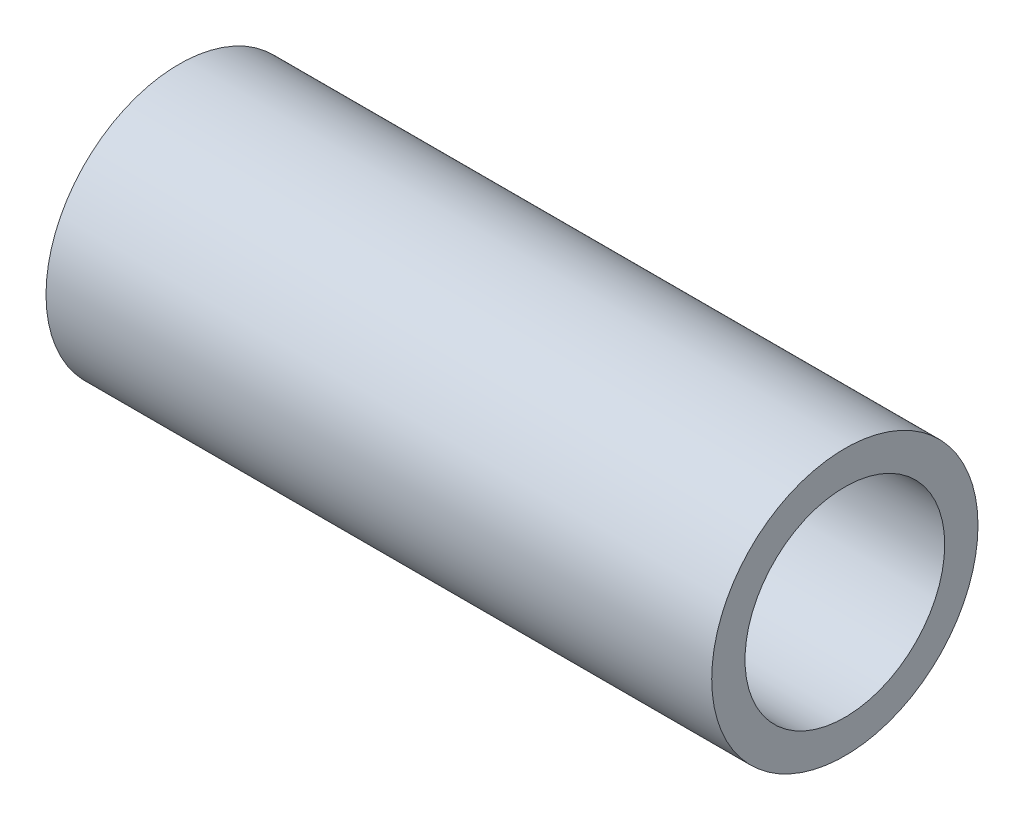
ISO-10303-21;
HEADER;
FILE_DESCRIPTION(('STEP AP214'),'2;1');
FILE_NAME('part.step','',(''),(''),'','','');
FILE_SCHEMA(('AUTOMOTIVE_DESIGN { 1 0 10303 214 1 1 1 1 }'));
ENDSEC;
DATA;
#1=APPLICATION_CONTEXT('core data for automotive mechanical design processes');
#2=APPLICATION_PROTOCOL_DEFINITION('international standard','automotive_design',2000,#1);
#3=PRODUCT_CONTEXT('',#1,'mechanical');
#4=PRODUCT('Part','Part','',(#3));
#5=PRODUCT_RELATED_PRODUCT_CATEGORY('part','',(#4));
#6=PRODUCT_DEFINITION_FORMATION('','',#4);
#7=PRODUCT_DEFINITION_CONTEXT('part definition',#1,'design');
#8=PRODUCT_DEFINITION('design','',#6,#7);
#9=PRODUCT_DEFINITION_SHAPE('','',#8);
#10=(LENGTH_UNIT() NAMED_UNIT(*) SI_UNIT(.MILLI.,.METRE.));
#11=(NAMED_UNIT(*) PLANE_ANGLE_UNIT() SI_UNIT($,.RADIAN.));
#12=(NAMED_UNIT(*) SI_UNIT($,.STERADIAN.) SOLID_ANGLE_UNIT());
#13=UNCERTAINTY_MEASURE_WITH_UNIT(LENGTH_MEASURE(1.E-05),#10,'distance_accuracy_value','');
#14=(GEOMETRIC_REPRESENTATION_CONTEXT(3) GLOBAL_UNCERTAINTY_ASSIGNED_CONTEXT((#13)) GLOBAL_UNIT_ASSIGNED_CONTEXT((#10,
#11,#12)) REPRESENTATION_CONTEXT('',''));
#15=CARTESIAN_POINT('',(0.,0.,0.));
#16=DIRECTION('',(0.,0.,1.));
#17=DIRECTION('',(1.,0.,0.));
#18=AXIS2_PLACEMENT_3D('',#15,#16,#17);
#19=CARTESIAN_POINT('',(15.875,0.,0.));
#20=DIRECTION('',(1.,0.,0.));
#21=DIRECTION('',(0.,0.,-1.));
#22=AXIS2_PLACEMENT_3D('',#19,#20,#21);
#23=PLANE('',#22);
#24=CARTESIAN_POINT('',(15.875,0.,0.));
#25=DIRECTION('',(1.,0.,0.));
#26=DIRECTION('',(0.,0.,-1.));
#27=AXIS2_PLACEMENT_3D('',#24,#25,#26);
#28=CIRCLE('',#27,6.35);
#29=CARTESIAN_POINT('',(15.875,0.,-6.35));
#30=VERTEX_POINT('',#29);
#31=EDGE_CURVE('E10',#30,#30,#28,.T.);
#32=ORIENTED_EDGE('',*,*,#31,.T.);
#33=EDGE_LOOP('',(#32));
#34=FACE_BOUND('',#33,.T.);
#35=CARTESIAN_POINT('',(15.875,0.,0.));
#36=DIRECTION('',(1.,0.,0.));
#37=DIRECTION('',(0.,0.,-1.));
#38=AXIS2_PLACEMENT_3D('',#35,#36,#37);
#39=CIRCLE('',#38,4.7625);
#40=CARTESIAN_POINT('',(15.875,0.,-4.7625));
#41=VERTEX_POINT('',#40);
#42=EDGE_CURVE('E44',#41,#41,#39,.T.);
#43=ORIENTED_EDGE('',*,*,#42,.F.);
#44=EDGE_LOOP('',(#43));
#45=FACE_BOUND('',#44,.T.);
#46=ADVANCED_FACE('F33',(#34,#45),#23,.T.);
#47=CARTESIAN_POINT('',(-15.875,0.,0.));
#48=DIRECTION('',(1.,0.,0.));
#49=DIRECTION('',(0.,0.,-1.));
#50=AXIS2_PLACEMENT_3D('',#47,#48,#49);
#51=PLANE('',#50);
#52=CARTESIAN_POINT('',(-15.875,0.,0.));
#53=DIRECTION('',(1.,0.,0.));
#54=DIRECTION('',(0.,0.,-1.));
#55=AXIS2_PLACEMENT_3D('',#52,#53,#54);
#56=CIRCLE('',#55,6.35);
#57=CARTESIAN_POINT('',(-15.875,0.,-6.35));
#58=VERTEX_POINT('',#57);
#59=EDGE_CURVE('E37',#58,#58,#56,.T.);
#60=ORIENTED_EDGE('',*,*,#59,.F.);
#61=EDGE_LOOP('',(#60));
#62=FACE_BOUND('',#61,.T.);
#63=CARTESIAN_POINT('',(-15.875,0.,0.));
#64=DIRECTION('',(1.,0.,0.));
#65=DIRECTION('',(0.,0.,-1.));
#66=AXIS2_PLACEMENT_3D('',#63,#64,#65);
#67=CIRCLE('',#66,4.7625);
#68=CARTESIAN_POINT('',(-15.875,0.,-4.7625));
#69=VERTEX_POINT('',#68);
#70=EDGE_CURVE('E46',#69,#69,#67,.T.);
#71=ORIENTED_EDGE('',*,*,#70,.T.);
#72=EDGE_LOOP('',(#71));
#73=FACE_BOUND('',#72,.T.);
#74=ADVANCED_FACE('F56',(#62,#73),#51,.F.);
#75=CARTESIAN_POINT('',(15.875,0.,0.));
#76=DIRECTION('',(-1.,0.,0.));
#77=DIRECTION('',(0.,0.,1.));
#78=AXIS2_PLACEMENT_3D('',#75,#76,#77);
#79=CYLINDRICAL_SURFACE('',#78,6.35);
#80=ORIENTED_EDGE('',*,*,#31,.F.);
#81=EDGE_LOOP('',(#80));
#82=FACE_BOUND('',#81,.T.);
#83=ORIENTED_EDGE('',*,*,#59,.T.);
#84=EDGE_LOOP('',(#83));
#85=FACE_BOUND('',#84,.T.);
#86=ADVANCED_FACE('F35',(#82,#85),#79,.T.);
#87=CARTESIAN_POINT('',(15.875,0.,0.));
#88=DIRECTION('',(-1.,0.,0.));
#89=DIRECTION('',(0.,0.,1.));
#90=AXIS2_PLACEMENT_3D('',#87,#88,#89);
#91=CYLINDRICAL_SURFACE('',#90,4.7625);
#92=ORIENTED_EDGE('',*,*,#42,.T.);
#93=EDGE_LOOP('',(#92));
#94=FACE_BOUND('',#93,.T.);
#95=ORIENTED_EDGE('',*,*,#70,.F.);
#96=EDGE_LOOP('',(#95));
#97=FACE_BOUND('',#96,.T.);
#98=ADVANCED_FACE('F52',(#94,#97),#91,.F.);
#99=CLOSED_SHELL('',(#46,#74,#86,#98));
#100=MANIFOLD_SOLID_BREP('B2',#99);
#101=ADVANCED_BREP_SHAPE_REPRESENTATION('',(#18,#100),#14);
#102=SHAPE_DEFINITION_REPRESENTATION(#9,#101);
ENDSEC;
END-ISO-10303-21;
